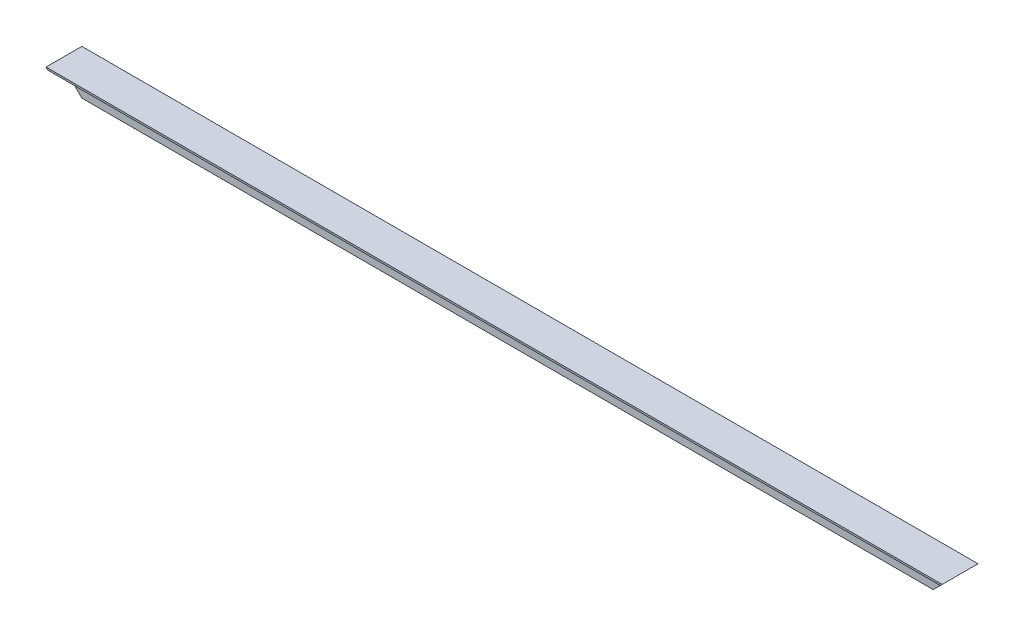
ISO-10303-21;
HEADER;
FILE_DESCRIPTION(('STEP AP214'),'2;1');
FILE_NAME('part.step','',(''),(''),'','','');
FILE_SCHEMA(('AUTOMOTIVE_DESIGN { 1 0 10303 214 1 1 1 1 }'));
ENDSEC;
DATA;
#1=APPLICATION_CONTEXT('core data for automotive mechanical design processes');
#2=APPLICATION_PROTOCOL_DEFINITION('international standard','automotive_design',2000,#1);
#3=PRODUCT_CONTEXT('',#1,'mechanical');
#4=PRODUCT('Part','Part','',(#3));
#5=PRODUCT_RELATED_PRODUCT_CATEGORY('part','',(#4));
#6=PRODUCT_DEFINITION_FORMATION('','',#4);
#7=PRODUCT_DEFINITION_CONTEXT('part definition',#1,'design');
#8=PRODUCT_DEFINITION('design','',#6,#7);
#9=PRODUCT_DEFINITION_SHAPE('','',#8);
#10=(LENGTH_UNIT() NAMED_UNIT(*) SI_UNIT(.MILLI.,.METRE.));
#11=(NAMED_UNIT(*) PLANE_ANGLE_UNIT() SI_UNIT($,.RADIAN.));
#12=(NAMED_UNIT(*) SI_UNIT($,.STERADIAN.) SOLID_ANGLE_UNIT());
#13=UNCERTAINTY_MEASURE_WITH_UNIT(LENGTH_MEASURE(1.E-05),#10,'distance_accuracy_value','');
#14=(GEOMETRIC_REPRESENTATION_CONTEXT(3) GLOBAL_UNCERTAINTY_ASSIGNED_CONTEXT((#13)) GLOBAL_UNIT_ASSIGNED_CONTEXT((#10,
#11,#12)) REPRESENTATION_CONTEXT('',''));
#15=CARTESIAN_POINT('',(0.,0.,0.));
#16=DIRECTION('',(0.,0.,1.));
#17=DIRECTION('',(1.,0.,0.));
#18=AXIS2_PLACEMENT_3D('',#15,#16,#17);
#19=CARTESIAN_POINT('',(0.,0.,40.));
#20=DIRECTION('',(0.,0.,1.));
#21=DIRECTION('',(1.,0.,0.));
#22=AXIS2_PLACEMENT_3D('',#19,#20,#21);
#23=PLANE('',#22);
#24=DIRECTION('',(-0.707106781186548,-0.707106781186547,0.));
#25=VECTOR('',#24,1.);
#26=CARTESIAN_POINT('',(419.68034889611,-419.680348896111,40.));
#27=LINE('',#26,#25);
#28=CARTESIAN_POINT('',(939.141785031804,99.7810872395833,40.));
#29=VERTEX_POINT('',#28);
#30=CARTESIAN_POINT('',(937.141785031804,97.7810872395835,40.));
#31=VERTEX_POINT('',#30);
#32=EDGE_CURVE('E55',#29,#31,#27,.T.);
#33=ORIENTED_EDGE('',*,*,#32,.F.);
#34=DIRECTION('',(-1.,0.,0.));
#35=VECTOR('',#34,1.);
#36=CARTESIAN_POINT('',(-60.8582149681956,99.7810872395833,40.));
#37=LINE('',#36,#35);
#38=CARTESIAN_POINT('',(-60.8582149681956,99.7810872395833,40.));
#39=VERTEX_POINT('',#38);
#40=EDGE_CURVE('E120',#29,#39,#37,.T.);
#41=ORIENTED_EDGE('',*,*,#40,.T.);
#42=DIRECTION('',(-0.707106781186548,0.707106781186547,0.));
#43=VECTOR('',#42,1.);
#44=CARTESIAN_POINT('',(19.4614361356939,19.4614361356939,40.));
#45=LINE('',#44,#43);
#46=CARTESIAN_POINT('',(-58.8582149681958,97.7810872395833,40.));
#47=VERTEX_POINT('',#46);
#48=EDGE_CURVE('E135',#47,#39,#45,.T.);
#49=ORIENTED_EDGE('',*,*,#48,.F.);
#50=DIRECTION('',(1.,0.,0.));
#51=VECTOR('',#50,1.);
#52=CARTESIAN_POINT('',(0.,97.7810872395833,40.));
#53=LINE('',#52,#51);
#54=EDGE_CURVE('E131',#47,#31,#53,.T.);
#55=ORIENTED_EDGE('',*,*,#54,.T.);
#56=EDGE_LOOP('',(#33,#41,#49,#55));
#57=FACE_BOUND('',#56,.T.);
#58=ADVANCED_FACE('F33',(#57),#23,.T.);
#59=CARTESIAN_POINT('',(-60.8582149681956,59.7810872395833,40.));
#60=DIRECTION('',(0.,1.,0.));
#61=DIRECTION('',(0.,0.,1.));
#62=AXIS2_PLACEMENT_3D('',#59,#60,#61);
#63=PLANE('',#62);
#64=DIRECTION('',(1.,0.,0.));
#65=VECTOR('',#64,1.);
#66=CARTESIAN_POINT('',(-60.8582149681956,59.7810872395833,0.));
#67=LINE('',#66,#65);
#68=CARTESIAN_POINT('',(-20.8582149681956,59.7810872395833,0.));
#69=VERTEX_POINT('',#68);
#70=CARTESIAN_POINT('',(899.141785031804,59.7810872395833,0.));
#71=VERTEX_POINT('',#70);
#72=EDGE_CURVE('E112',#69,#71,#67,.T.);
#73=ORIENTED_EDGE('',*,*,#72,.T.);
#74=DIRECTION('',(0.,0.,-1.));
#75=VECTOR('',#74,1.);
#76=CARTESIAN_POINT('',(899.141785031804,59.7810872395833,1064.));
#77=LINE('',#76,#75);
#78=CARTESIAN_POINT('',(899.141785031804,59.7810872395833,2.));
#79=VERTEX_POINT('',#78);
#80=EDGE_CURVE('E95',#79,#71,#77,.T.);
#81=ORIENTED_EDGE('',*,*,#80,.F.);
#82=DIRECTION('',(-1.,0.,0.));
#83=VECTOR('',#82,1.);
#84=CARTESIAN_POINT('',(1003.1417850318,59.7810872395835,2.));
#85=LINE('',#84,#83);
#86=CARTESIAN_POINT('',(-20.8582149681956,59.7810872395833,2.));
#87=VERTEX_POINT('',#86);
#88=EDGE_CURVE('E118',#79,#87,#85,.T.);
#89=ORIENTED_EDGE('',*,*,#88,.T.);
#90=DIRECTION('',(0.,0.,-1.));
#91=VECTOR('',#90,1.);
#92=CARTESIAN_POINT('',(-20.8582149681956,59.7810872395833,1064.));
#93=LINE('',#92,#91);
#94=EDGE_CURVE('E115',#87,#69,#93,.T.);
#95=ORIENTED_EDGE('',*,*,#94,.T.);
#96=EDGE_LOOP('',(#73,#81,#89,#95));
#97=FACE_BOUND('',#96,.T.);
#98=ADVANCED_FACE('F35',(#97),#63,.F.);
#99=CARTESIAN_POINT('',(-60.8582149681956,99.7810872395833,40.));
#100=DIRECTION('',(0.,-1.,0.));
#101=DIRECTION('',(0.,0.,-1.));
#102=AXIS2_PLACEMENT_3D('',#99,#100,#101);
#103=PLANE('',#102);
#104=DIRECTION('',(-1.,0.,0.));
#105=VECTOR('',#104,1.);
#106=CARTESIAN_POINT('',(-60.8582149681956,99.7810872395833,0.));
#107=LINE('',#106,#105);
#108=CARTESIAN_POINT('',(939.141785031804,99.7810872395833,0.));
#109=VERTEX_POINT('',#108);
#110=CARTESIAN_POINT('',(-60.8582149681956,99.7810872395833,0.));
#111=VERTEX_POINT('',#110);
#112=EDGE_CURVE('E114',#109,#111,#107,.T.);
#113=ORIENTED_EDGE('',*,*,#112,.T.);
#114=DIRECTION('',(0.,0.,-1.));
#115=VECTOR('',#114,1.);
#116=CARTESIAN_POINT('',(-60.8582149681956,99.7810872395833,40.));
#117=LINE('',#116,#115);
#118=EDGE_CURVE('E127',#39,#111,#117,.T.);
#119=ORIENTED_EDGE('',*,*,#118,.F.);
#120=ORIENTED_EDGE('',*,*,#40,.F.);
#121=DIRECTION('',(0.,0.,-1.));
#122=VECTOR('',#121,1.);
#123=CARTESIAN_POINT('',(939.141785031804,99.7810872395833,40.));
#124=LINE('',#123,#122);
#125=EDGE_CURVE('E129',#29,#109,#124,.T.);
#126=ORIENTED_EDGE('',*,*,#125,.T.);
#127=EDGE_LOOP('',(#113,#119,#120,#126));
#128=FACE_BOUND('',#127,.T.);
#129=ADVANCED_FACE('F179',(#128),#103,.F.);
#130=CARTESIAN_POINT('',(0.,0.,0.));
#131=DIRECTION('',(0.,0.,1.));
#132=DIRECTION('',(1.,0.,0.));
#133=AXIS2_PLACEMENT_3D('',#130,#131,#132);
#134=PLANE('',#133);
#135=ORIENTED_EDGE('',*,*,#112,.F.);
#136=DIRECTION('',(0.707106781186548,0.707106781186547,0.));
#137=VECTOR('',#136,1.);
#138=CARTESIAN_POINT('',(939.141785031804,99.7810872395833,0.));
#139=LINE('',#138,#137);
#140=EDGE_CURVE('E98',#71,#109,#139,.T.);
#141=ORIENTED_EDGE('',*,*,#140,.F.);
#142=ORIENTED_EDGE('',*,*,#72,.F.);
#143=DIRECTION('',(0.707106781186548,-0.707106781186547,0.));
#144=VECTOR('',#143,1.);
#145=CARTESIAN_POINT('',(-20.8582149681956,59.7810872395833,0.));
#146=LINE('',#145,#144);
#147=EDGE_CURVE('E177',#111,#69,#146,.T.);
#148=ORIENTED_EDGE('',*,*,#147,.F.);
#149=EDGE_LOOP('',(#135,#141,#142,#148));
#150=FACE_BOUND('',#149,.T.);
#151=ADVANCED_FACE('F110',(#150),#134,.F.);
#152=CARTESIAN_POINT('',(1003.1417850318,1.7523915253291E-13,2.00000000000001));
#153=DIRECTION('',(0.,0.,-1.));
#154=DIRECTION('',(0.,1.,0.));
#155=AXIS2_PLACEMENT_3D('',#152,#153,#154);
#156=PLANE('',#155);
#157=ORIENTED_EDGE('',*,*,#88,.F.);
#158=DIRECTION('',(0.707106781186548,0.707106781186547,0.));
#159=VECTOR('',#158,1.);
#160=CARTESIAN_POINT('',(921.251241412013,81.8905436197918,2.));
#161=LINE('',#160,#159);
#162=CARTESIAN_POINT('',(914.141785031804,74.7810872395835,2.));
#163=VERTEX_POINT('',#162);
#164=EDGE_CURVE('E101',#79,#163,#161,.T.);
#165=ORIENTED_EDGE('',*,*,#164,.T.);
#166=DIRECTION('',(-1.,0.,0.));
#167=VECTOR('',#166,1.);
#168=CARTESIAN_POINT('',(1003.1417850318,74.7810872395835,2.));
#169=LINE('',#168,#167);
#170=CARTESIAN_POINT('',(-35.8582149681959,74.7810872395833,2.));
#171=VERTEX_POINT('',#170);
#172=EDGE_CURVE('E122',#163,#171,#169,.T.);
#173=ORIENTED_EDGE('',*,*,#172,.T.);
#174=DIRECTION('',(0.707106781186548,-0.707106781186547,0.));
#175=VECTOR('',#174,1.);
#176=CARTESIAN_POINT('',(521.032328651596,-482.109456380208,2.00000000000006));
#177=LINE('',#176,#175);
#178=EDGE_CURVE('E145',#171,#87,#177,.T.);
#179=ORIENTED_EDGE('',*,*,#178,.T.);
#180=EDGE_LOOP('',(#157,#165,#173,#179));
#181=FACE_BOUND('',#180,.T.);
#182=ADVANCED_FACE('F171',(#181),#156,.F.);
#183=CARTESIAN_POINT('',(1003.1417850318,74.7810872395835,0.));
#184=DIRECTION('',(0.,-1.,0.));
#185=DIRECTION('',(1.,0.,0.));
#186=AXIS2_PLACEMENT_3D('',#183,#184,#185);
#187=PLANE('',#186);
#188=DIRECTION('',(0.,0.,-1.));
#189=VECTOR('',#188,1.);
#190=CARTESIAN_POINT('',(914.141785031804,74.7810872395835,0.));
#191=LINE('',#190,#189);
#192=CARTESIAN_POINT('',(914.141785031804,74.7810872395833,25.));
#193=VERTEX_POINT('',#192);
#194=EDGE_CURVE('E156',#193,#163,#191,.T.);
#195=ORIENTED_EDGE('',*,*,#194,.F.);
#196=DIRECTION('',(-1.,0.,0.));
#197=VECTOR('',#196,1.);
#198=CARTESIAN_POINT('',(1003.1417850318,74.7810872395835,25.));
#199=LINE('',#198,#197);
#200=CARTESIAN_POINT('',(-35.8582149681957,74.7810872395833,25.));
#201=VERTEX_POINT('',#200);
#202=EDGE_CURVE('E155',#193,#201,#199,.T.);
#203=ORIENTED_EDGE('',*,*,#202,.T.);
#204=DIRECTION('',(0.,0.,1.));
#205=VECTOR('',#204,1.);
#206=CARTESIAN_POINT('',(-35.8582149681959,74.7810872395833,0.));
#207=LINE('',#206,#205);
#208=EDGE_CURVE('E169',#171,#201,#207,.T.);
#209=ORIENTED_EDGE('',*,*,#208,.F.);
#210=ORIENTED_EDGE('',*,*,#172,.F.);
#211=EDGE_LOOP('',(#195,#203,#209,#210));
#212=FACE_BOUND('',#211,.T.);
#213=ADVANCED_FACE('F167',(#212),#187,.T.);
#214=CARTESIAN_POINT('',(1003.1417850318,1.787789940607E-13,25.));
#215=DIRECTION('',(0.,0.,-1.));
#216=DIRECTION('',(0.,1.,0.));
#217=AXIS2_PLACEMENT_3D('',#214,#215,#216);
#218=PLANE('',#217);
#219=ORIENTED_EDGE('',*,*,#202,.F.);
#220=DIRECTION('',(0.707106781186548,0.707106781186547,0.));
#221=VECTOR('',#220,1.);
#222=CARTESIAN_POINT('',(921.251241412013,81.8905436197918,25.));
#223=LINE('',#222,#221);
#224=CARTESIAN_POINT('',(937.141785031804,97.7810872395835,25.));
#225=VERTEX_POINT('',#224);
#226=EDGE_CURVE('E144',#193,#225,#223,.T.);
#227=ORIENTED_EDGE('',*,*,#226,.T.);
#228=DIRECTION('',(-1.,0.,0.));
#229=VECTOR('',#228,1.);
#230=CARTESIAN_POINT('',(1003.1417850318,97.7810872395835,25.));
#231=LINE('',#230,#229);
#232=CARTESIAN_POINT('',(-58.8582149681958,97.7810872395833,25.));
#233=VERTEX_POINT('',#232);
#234=EDGE_CURVE('E148',#225,#233,#231,.T.);
#235=ORIENTED_EDGE('',*,*,#234,.T.);
#236=DIRECTION('',(0.707106781186548,-0.707106781186547,0.));
#237=VECTOR('',#236,1.);
#238=CARTESIAN_POINT('',(521.032328651596,-482.109456380208,25.0000000000001));
#239=LINE('',#238,#237);
#240=EDGE_CURVE('E48',#233,#201,#239,.T.);
#241=ORIENTED_EDGE('',*,*,#240,.T.);
#242=EDGE_LOOP('',(#219,#227,#235,#241));
#243=FACE_BOUND('',#242,.T.);
#244=ADVANCED_FACE('F153',(#243),#218,.F.);
#245=CARTESIAN_POINT('',(1003.1417850318,97.7810872395835,0.));
#246=DIRECTION('',(0.,-1.,0.));
#247=DIRECTION('',(1.,0.,0.));
#248=AXIS2_PLACEMENT_3D('',#245,#246,#247);
#249=PLANE('',#248);
#250=DIRECTION('',(0.,0.,-1.));
#251=VECTOR('',#250,1.);
#252=CARTESIAN_POINT('',(937.141785031804,97.7810872395835,0.));
#253=LINE('',#252,#251);
#254=EDGE_CURVE('E11',#31,#225,#253,.T.);
#255=ORIENTED_EDGE('',*,*,#254,.F.);
#256=ORIENTED_EDGE('',*,*,#54,.F.);
#257=DIRECTION('',(0.,0.,1.));
#258=VECTOR('',#257,1.);
#259=CARTESIAN_POINT('',(-58.8582149681958,97.7810872395833,0.));
#260=LINE('',#259,#258);
#261=EDGE_CURVE('E41',#233,#47,#260,.T.);
#262=ORIENTED_EDGE('',*,*,#261,.F.);
#263=ORIENTED_EDGE('',*,*,#234,.F.);
#264=EDGE_LOOP('',(#255,#256,#262,#263));
#265=FACE_BOUND('',#264,.T.);
#266=ADVANCED_FACE('F147',(#265),#249,.T.);
#267=CARTESIAN_POINT('',(-20.8582149681956,59.7810872395833,1064.));
#268=DIRECTION('',(0.707106781186547,0.707106781186547,0.));
#269=DIRECTION('',(-0.707106781186548,0.707106781186547,0.));
#270=AXIS2_PLACEMENT_3D('',#267,#268,#269);
#271=PLANE('',#270);
#272=ORIENTED_EDGE('',*,*,#48,.T.);
#273=ORIENTED_EDGE('',*,*,#118,.T.);
#274=ORIENTED_EDGE('',*,*,#147,.T.);
#275=ORIENTED_EDGE('',*,*,#94,.F.);
#276=ORIENTED_EDGE('',*,*,#178,.F.);
#277=ORIENTED_EDGE('',*,*,#208,.T.);
#278=ORIENTED_EDGE('',*,*,#240,.F.);
#279=ORIENTED_EDGE('',*,*,#261,.T.);
#280=EDGE_LOOP('',(#272,#273,#274,#275,#276,#277,#278,#279));
#281=FACE_BOUND('',#280,.T.);
#282=ADVANCED_FACE('F134',(#281),#271,.F.);
#283=CARTESIAN_POINT('',(939.141785031804,99.7810872395833,1064.));
#284=DIRECTION('',(-0.707106781186547,0.707106781186548,0.));
#285=DIRECTION('',(-0.707106781186548,-0.707106781186547,0.));
#286=AXIS2_PLACEMENT_3D('',#283,#284,#285);
#287=PLANE('',#286);
#288=ORIENTED_EDGE('',*,*,#32,.T.);
#289=ORIENTED_EDGE('',*,*,#254,.T.);
#290=ORIENTED_EDGE('',*,*,#226,.F.);
#291=ORIENTED_EDGE('',*,*,#194,.T.);
#292=ORIENTED_EDGE('',*,*,#164,.F.);
#293=ORIENTED_EDGE('',*,*,#80,.T.);
#294=ORIENTED_EDGE('',*,*,#140,.T.);
#295=ORIENTED_EDGE('',*,*,#125,.F.);
#296=EDGE_LOOP('',(#288,#289,#290,#291,#292,#293,#294,#295));
#297=FACE_BOUND('',#296,.T.);
#298=ADVANCED_FACE('F97',(#297),#287,.F.);
#299=CLOSED_SHELL('',(#58,#98,#129,#151,#182,#213,#244,#266,#282,#298));
#300=MANIFOLD_SOLID_BREP('B2',#299);
#301=ADVANCED_BREP_SHAPE_REPRESENTATION('',(#18,#300),#14);
#302=SHAPE_DEFINITION_REPRESENTATION(#9,#301);
ENDSEC;
END-ISO-10303-21;
